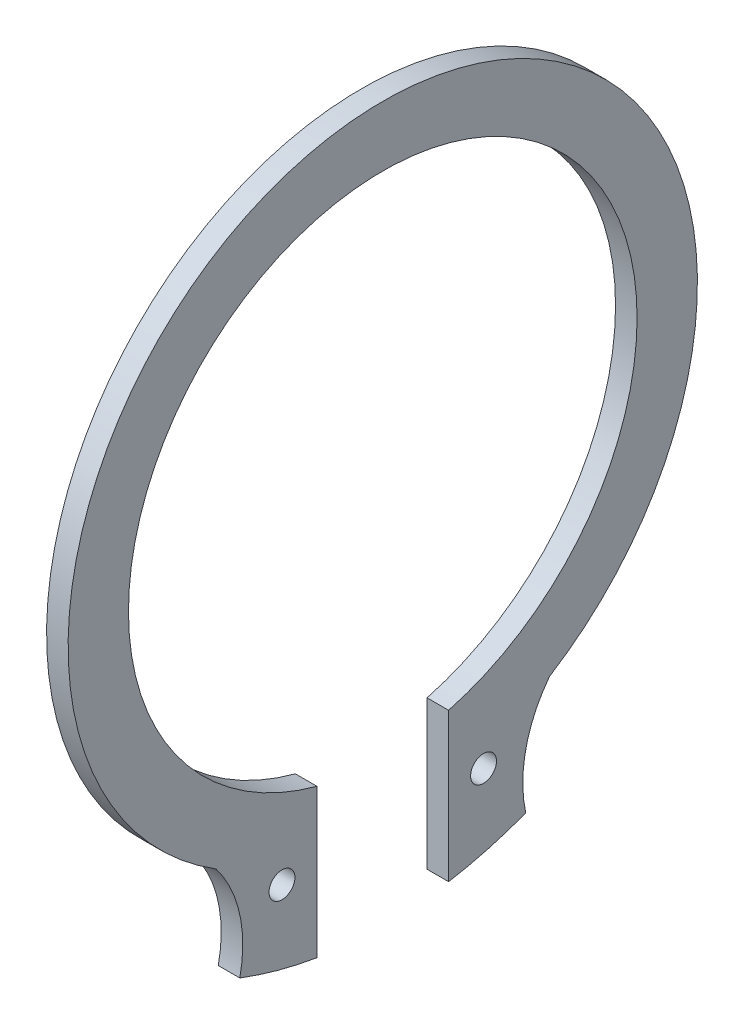
ISO-10303-21;
HEADER;
FILE_DESCRIPTION(('STEP AP214'),'2;1');
FILE_NAME('part.step','',(''),(''),'','','');
FILE_SCHEMA(('AUTOMOTIVE_DESIGN { 1 0 10303 214 1 1 1 1 }'));
ENDSEC;
DATA;
#1=APPLICATION_CONTEXT('core data for automotive mechanical design processes');
#2=APPLICATION_PROTOCOL_DEFINITION('international standard','automotive_design',2000,#1);
#3=PRODUCT_CONTEXT('',#1,'mechanical');
#4=PRODUCT('Part','Part','',(#3));
#5=PRODUCT_RELATED_PRODUCT_CATEGORY('part','',(#4));
#6=PRODUCT_DEFINITION_FORMATION('','',#4);
#7=PRODUCT_DEFINITION_CONTEXT('part definition',#1,'design');
#8=PRODUCT_DEFINITION('design','',#6,#7);
#9=PRODUCT_DEFINITION_SHAPE('','',#8);
#10=(LENGTH_UNIT() NAMED_UNIT(*) SI_UNIT(.MILLI.,.METRE.));
#11=(NAMED_UNIT(*) PLANE_ANGLE_UNIT() SI_UNIT($,.RADIAN.));
#12=(NAMED_UNIT(*) SI_UNIT($,.STERADIAN.) SOLID_ANGLE_UNIT());
#13=UNCERTAINTY_MEASURE_WITH_UNIT(LENGTH_MEASURE(1.E-05),#10,'distance_accuracy_value','');
#14=(GEOMETRIC_REPRESENTATION_CONTEXT(3) GLOBAL_UNCERTAINTY_ASSIGNED_CONTEXT((#13)) GLOBAL_UNIT_ASSIGNED_CONTEXT((#10,
#11,#12)) REPRESENTATION_CONTEXT('',''));
#15=CARTESIAN_POINT('',(0.,0.,0.));
#16=DIRECTION('',(0.,0.,1.));
#17=DIRECTION('',(1.,0.,0.));
#18=AXIS2_PLACEMENT_3D('',#15,#16,#17);
#19=CARTESIAN_POINT('',(2.5,-40.0850842394597,-31.240494090419));
#20=DIRECTION('',(-1.,0.,0.));
#21=DIRECTION('',(0.,0.,1.));
#22=AXIS2_PLACEMENT_3D('',#19,#20,#21);
#23=PLANE('',#22);
#24=CARTESIAN_POINT('',(2.5,-40.0850842394597,-31.240494090419));
#25=DIRECTION('',(-1.,0.,0.));
#26=DIRECTION('',(0.,0.,1.));
#27=AXIS2_PLACEMENT_3D('',#24,#25,#26);
#28=CIRCLE('',#27,15.);
#29=CARTESIAN_POINT('',(2.5,-43.2811948248844,-16.5849532568048));
#30=VERTEX_POINT('',#29);
#31=CARTESIAN_POINT('',(2.5,-30.9560717102877,-19.3383459547999));
#32=VERTEX_POINT('',#31);
#33=EDGE_CURVE('E147',#30,#32,#28,.T.);
#34=ORIENTED_EDGE('',*,*,#33,.T.);
#35=CARTESIAN_POINT('',(2.5,0.,0.));
#36=DIRECTION('',(1.,0.,0.));
#37=DIRECTION('',(0.,0.,-1.));
#38=AXIS2_PLACEMENT_3D('',#35,#36,#37);
#39=CIRCLE('',#38,36.5);
#40=CARTESIAN_POINT('',(2.5,-30.9560717102877,19.3383459547999));
#41=VERTEX_POINT('',#40);
#42=EDGE_CURVE('E95',#32,#41,#39,.T.);
#43=ORIENTED_EDGE('',*,*,#42,.T.);
#44=CARTESIAN_POINT('',(2.5,-40.0850842394597,31.240494090419));
#45=DIRECTION('',(-1.,0.,0.));
#46=DIRECTION('',(0.,0.,-1.));
#47=AXIS2_PLACEMENT_3D('',#44,#45,#46);
#48=CIRCLE('',#47,15.);
#49=CARTESIAN_POINT('',(2.5,-43.2811948248844,16.5849532568047));
#50=VERTEX_POINT('',#49);
#51=EDGE_CURVE('E162',#41,#50,#48,.T.);
#52=ORIENTED_EDGE('',*,*,#51,.T.);
#53=CARTESIAN_POINT('',(2.5,0.,0.));
#54=DIRECTION('',(1.,0.,0.));
#55=DIRECTION('',(0.,0.,-1.));
#56=AXIS2_PLACEMENT_3D('',#53,#54,#55);
#57=CIRCLE('',#56,46.35);
#58=CARTESIAN_POINT('',(2.5,-45.7168109541961,7.63516183052438));
#59=VERTEX_POINT('',#58);
#60=EDGE_CURVE('E175',#50,#59,#57,.T.);
#61=ORIENTED_EDGE('',*,*,#60,.T.);
#62=DIRECTION('',(0.,1.,0.));
#63=VECTOR('',#62,1.);
#64=CARTESIAN_POINT('',(2.5,-28.4948118755275,7.63516183052438));
#65=LINE('',#64,#63);
#66=CARTESIAN_POINT('',(2.5,-28.4948118755275,7.63516183052436));
#67=VERTEX_POINT('',#66);
#68=EDGE_CURVE('E114',#59,#67,#65,.T.);
#69=ORIENTED_EDGE('',*,*,#68,.T.);
#70=CARTESIAN_POINT('',(2.5,0.,0.));
#71=DIRECTION('',(-1.,0.,0.));
#72=DIRECTION('',(0.,0.,-1.));
#73=AXIS2_PLACEMENT_3D('',#70,#71,#72);
#74=CIRCLE('',#73,29.5);
#75=CARTESIAN_POINT('',(2.5,-28.4948118755275,-7.63516183052439));
#76=VERTEX_POINT('',#75);
#77=EDGE_CURVE('E108',#67,#76,#74,.T.);
#78=ORIENTED_EDGE('',*,*,#77,.T.);
#79=DIRECTION('',(0.,-1.,0.));
#80=VECTOR('',#79,1.);
#81=CARTESIAN_POINT('',(2.5,-28.4948118755275,-7.63516183052439));
#82=LINE('',#81,#80);
#83=CARTESIAN_POINT('',(2.5,-45.7168109541961,-7.63516183052439));
#84=VERTEX_POINT('',#83);
#85=EDGE_CURVE('E112',#76,#84,#82,.T.);
#86=ORIENTED_EDGE('',*,*,#85,.T.);
#87=CARTESIAN_POINT('',(2.5,0.,0.));
#88=DIRECTION('',(1.,0.,0.));
#89=DIRECTION('',(0.,0.,1.));
#90=AXIS2_PLACEMENT_3D('',#87,#88,#89);
#91=CIRCLE('',#90,46.35);
#92=EDGE_CURVE('E52',#84,#30,#91,.T.);
#93=ORIENTED_EDGE('',*,*,#92,.T.);
#94=EDGE_LOOP('',(#34,#43,#52,#61,#69,#78,#86,#93));
#95=FACE_BOUND('',#94,.T.);
#96=CARTESIAN_POINT('',(2.5,-36.3642688667526,11.6902262832212));
#97=DIRECTION('',(1.,0.,0.));
#98=DIRECTION('',(0.,0.,-1.));
#99=AXIS2_PLACEMENT_3D('',#96,#97,#98);
#100=CIRCLE('',#99,1.5);
#101=CARTESIAN_POINT('',(2.5,-36.3642688667526,10.1902262832212));
#102=VERTEX_POINT('',#101);
#103=EDGE_CURVE('E136',#102,#102,#100,.T.);
#104=ORIENTED_EDGE('',*,*,#103,.F.);
#105=EDGE_LOOP('',(#104));
#106=FACE_BOUND('',#105,.T.);
#107=CARTESIAN_POINT('',(2.5,-36.3642688667526,-11.6902262832213));
#108=DIRECTION('',(1.,0.,0.));
#109=DIRECTION('',(0.,0.,1.));
#110=AXIS2_PLACEMENT_3D('',#107,#108,#109);
#111=CIRCLE('',#110,1.5);
#112=CARTESIAN_POINT('',(2.5,-36.3642688667526,-10.1902262832213));
#113=VERTEX_POINT('',#112);
#114=EDGE_CURVE('E184',#113,#113,#111,.T.);
#115=ORIENTED_EDGE('',*,*,#114,.F.);
#116=EDGE_LOOP('',(#115));
#117=FACE_BOUND('',#116,.T.);
#118=ADVANCED_FACE('F35',(#95,#106,#117),#23,.F.);
#119=CARTESIAN_POINT('',(0.,-40.0850842394597,-31.240494090419));
#120=DIRECTION('',(-1.,0.,0.));
#121=DIRECTION('',(0.,0.,1.));
#122=AXIS2_PLACEMENT_3D('',#119,#120,#121);
#123=PLANE('',#122);
#124=CARTESIAN_POINT('',(0.,-36.3642688667526,11.6902262832212));
#125=DIRECTION('',(1.,0.,0.));
#126=DIRECTION('',(0.,0.,-1.));
#127=AXIS2_PLACEMENT_3D('',#124,#125,#126);
#128=CIRCLE('',#127,1.5);
#129=CARTESIAN_POINT('',(0.,-36.3642688667526,10.1902262832212));
#130=VERTEX_POINT('',#129);
#131=EDGE_CURVE('E181',#130,#130,#128,.T.);
#132=ORIENTED_EDGE('',*,*,#131,.T.);
#133=EDGE_LOOP('',(#132));
#134=FACE_BOUND('',#133,.T.);
#135=CARTESIAN_POINT('',(0.,-40.0850842394597,-31.240494090419));
#136=DIRECTION('',(-1.,0.,0.));
#137=DIRECTION('',(0.,0.,1.));
#138=AXIS2_PLACEMENT_3D('',#135,#136,#137);
#139=CIRCLE('',#138,15.);
#140=CARTESIAN_POINT('',(0.,-43.2811948248844,-16.5849532568048));
#141=VERTEX_POINT('',#140);
#142=CARTESIAN_POINT('',(0.,-30.9560717102877,-19.3383459547999));
#143=VERTEX_POINT('',#142);
#144=EDGE_CURVE('E132',#141,#143,#139,.T.);
#145=ORIENTED_EDGE('',*,*,#144,.F.);
#146=CARTESIAN_POINT('',(0.,0.,0.));
#147=DIRECTION('',(1.,0.,0.));
#148=DIRECTION('',(0.,0.,1.));
#149=AXIS2_PLACEMENT_3D('',#146,#147,#148);
#150=CIRCLE('',#149,46.35);
#151=CARTESIAN_POINT('',(0.,-45.7168109541961,-7.63516183052439));
#152=VERTEX_POINT('',#151);
#153=EDGE_CURVE('E87',#152,#141,#150,.T.);
#154=ORIENTED_EDGE('',*,*,#153,.F.);
#155=DIRECTION('',(0.,-1.,0.));
#156=VECTOR('',#155,1.);
#157=CARTESIAN_POINT('',(0.,-28.4948118755275,-7.63516183052439));
#158=LINE('',#157,#156);
#159=CARTESIAN_POINT('',(0.,-28.4948118755275,-7.63516183052439));
#160=VERTEX_POINT('',#159);
#161=EDGE_CURVE('E81',#160,#152,#158,.T.);
#162=ORIENTED_EDGE('',*,*,#161,.F.);
#163=CARTESIAN_POINT('',(0.,0.,0.));
#164=DIRECTION('',(-1.,0.,0.));
#165=DIRECTION('',(0.,0.,-1.));
#166=AXIS2_PLACEMENT_3D('',#163,#164,#165);
#167=CIRCLE('',#166,29.5);
#168=CARTESIAN_POINT('',(0.,-28.4948118755275,7.63516183052436));
#169=VERTEX_POINT('',#168);
#170=EDGE_CURVE('E122',#169,#160,#167,.T.);
#171=ORIENTED_EDGE('',*,*,#170,.F.);
#172=DIRECTION('',(0.,1.,0.));
#173=VECTOR('',#172,1.);
#174=CARTESIAN_POINT('',(0.,-28.4948118755275,7.63516183052438));
#175=LINE('',#174,#173);
#176=CARTESIAN_POINT('',(0.,-45.7168109541961,7.63516183052438));
#177=VERTEX_POINT('',#176);
#178=EDGE_CURVE('E142',#177,#169,#175,.T.);
#179=ORIENTED_EDGE('',*,*,#178,.F.);
#180=CARTESIAN_POINT('',(0.,0.,0.));
#181=DIRECTION('',(1.,0.,0.));
#182=DIRECTION('',(0.,0.,-1.));
#183=AXIS2_PLACEMENT_3D('',#180,#181,#182);
#184=CIRCLE('',#183,46.35);
#185=CARTESIAN_POINT('',(0.,-43.2811948248844,16.5849532568047));
#186=VERTEX_POINT('',#185);
#187=EDGE_CURVE('E140',#186,#177,#184,.T.);
#188=ORIENTED_EDGE('',*,*,#187,.F.);
#189=CARTESIAN_POINT('',(0.,-40.0850842394597,31.240494090419));
#190=DIRECTION('',(-1.,0.,0.));
#191=DIRECTION('',(0.,0.,-1.));
#192=AXIS2_PLACEMENT_3D('',#189,#190,#191);
#193=CIRCLE('',#192,15.);
#194=CARTESIAN_POINT('',(0.,-30.9560717102877,19.3383459547999));
#195=VERTEX_POINT('',#194);
#196=EDGE_CURVE('E138',#195,#186,#193,.T.);
#197=ORIENTED_EDGE('',*,*,#196,.F.);
#198=CARTESIAN_POINT('',(0.,0.,0.));
#199=DIRECTION('',(1.,0.,0.));
#200=DIRECTION('',(0.,0.,-1.));
#201=AXIS2_PLACEMENT_3D('',#198,#199,#200);
#202=CIRCLE('',#201,36.5);
#203=EDGE_CURVE('E135',#143,#195,#202,.T.);
#204=ORIENTED_EDGE('',*,*,#203,.F.);
#205=EDGE_LOOP('',(#145,#154,#162,#171,#179,#188,#197,#204));
#206=FACE_BOUND('',#205,.T.);
#207=CARTESIAN_POINT('',(0.,-36.3642688667526,-11.6902262832213));
#208=DIRECTION('',(1.,0.,0.));
#209=DIRECTION('',(0.,0.,1.));
#210=AXIS2_PLACEMENT_3D('',#207,#208,#209);
#211=CIRCLE('',#210,1.5);
#212=CARTESIAN_POINT('',(0.,-36.3642688667526,-10.1902262832213));
#213=VERTEX_POINT('',#212);
#214=EDGE_CURVE('E187',#213,#213,#211,.T.);
#215=ORIENTED_EDGE('',*,*,#214,.T.);
#216=EDGE_LOOP('',(#215));
#217=FACE_BOUND('',#216,.T.);
#218=ADVANCED_FACE('F166',(#134,#206,#217),#123,.T.);
#219=CARTESIAN_POINT('',(2.5,-40.0850842394597,-31.240494090419));
#220=DIRECTION('',(-1.,0.,0.));
#221=DIRECTION('',(0.,0.,1.));
#222=AXIS2_PLACEMENT_3D('',#219,#220,#221);
#223=CYLINDRICAL_SURFACE('',#222,15.);
#224=ORIENTED_EDGE('',*,*,#144,.T.);
#225=DIRECTION('',(-1.,0.,0.));
#226=VECTOR('',#225,1.);
#227=CARTESIAN_POINT('',(2.5,-30.9560717102877,-19.3383459547999));
#228=LINE('',#227,#226);
#229=EDGE_CURVE('E11',#32,#143,#228,.T.);
#230=ORIENTED_EDGE('',*,*,#229,.F.);
#231=ORIENTED_EDGE('',*,*,#33,.F.);
#232=DIRECTION('',(-1.,0.,0.));
#233=VECTOR('',#232,1.);
#234=CARTESIAN_POINT('',(2.5,-43.2811948248844,-16.5849532568048));
#235=LINE('',#234,#233);
#236=EDGE_CURVE('E128',#30,#141,#235,.T.);
#237=ORIENTED_EDGE('',*,*,#236,.T.);
#238=EDGE_LOOP('',(#224,#230,#231,#237));
#239=FACE_BOUND('',#238,.T.);
#240=ADVANCED_FACE('F37',(#239),#223,.F.);
#241=CARTESIAN_POINT('',(2.5,0.,0.));
#242=DIRECTION('',(-1.,0.,0.));
#243=DIRECTION('',(0.,0.,1.));
#244=AXIS2_PLACEMENT_3D('',#241,#242,#243);
#245=CYLINDRICAL_SURFACE('',#244,36.5);
#246=ORIENTED_EDGE('',*,*,#203,.T.);
#247=DIRECTION('',(-1.,0.,0.));
#248=VECTOR('',#247,1.);
#249=CARTESIAN_POINT('',(2.5,-30.9560717102877,19.3383459547999));
#250=LINE('',#249,#248);
#251=EDGE_CURVE('E44',#41,#195,#250,.T.);
#252=ORIENTED_EDGE('',*,*,#251,.F.);
#253=ORIENTED_EDGE('',*,*,#42,.F.);
#254=ORIENTED_EDGE('',*,*,#229,.T.);
#255=EDGE_LOOP('',(#246,#252,#253,#254));
#256=FACE_BOUND('',#255,.T.);
#257=ADVANCED_FACE('F219',(#256),#245,.T.);
#258=CARTESIAN_POINT('',(2.5,-40.0850842394597,31.240494090419));
#259=DIRECTION('',(-1.,0.,0.));
#260=DIRECTION('',(0.,0.,1.));
#261=AXIS2_PLACEMENT_3D('',#258,#259,#260);
#262=CYLINDRICAL_SURFACE('',#261,15.);
#263=ORIENTED_EDGE('',*,*,#196,.T.);
#264=DIRECTION('',(-1.,0.,0.));
#265=VECTOR('',#264,1.);
#266=CARTESIAN_POINT('',(2.5,-43.2811948248844,16.5849532568047));
#267=LINE('',#266,#265);
#268=EDGE_CURVE('E154',#50,#186,#267,.T.);
#269=ORIENTED_EDGE('',*,*,#268,.F.);
#270=ORIENTED_EDGE('',*,*,#51,.F.);
#271=ORIENTED_EDGE('',*,*,#251,.T.);
#272=EDGE_LOOP('',(#263,#269,#270,#271));
#273=FACE_BOUND('',#272,.T.);
#274=ADVANCED_FACE('F160',(#273),#262,.F.);
#275=CARTESIAN_POINT('',(2.5,0.,0.));
#276=DIRECTION('',(-1.,0.,0.));
#277=DIRECTION('',(0.,0.,1.));
#278=AXIS2_PLACEMENT_3D('',#275,#276,#277);
#279=CYLINDRICAL_SURFACE('',#278,46.35);
#280=ORIENTED_EDGE('',*,*,#187,.T.);
#281=DIRECTION('',(-1.,0.,0.));
#282=VECTOR('',#281,1.);
#283=CARTESIAN_POINT('',(2.5,-45.7168109541961,7.63516183052438));
#284=LINE('',#283,#282);
#285=EDGE_CURVE('E151',#59,#177,#284,.T.);
#286=ORIENTED_EDGE('',*,*,#285,.F.);
#287=ORIENTED_EDGE('',*,*,#60,.F.);
#288=ORIENTED_EDGE('',*,*,#268,.T.);
#289=EDGE_LOOP('',(#280,#286,#287,#288));
#290=FACE_BOUND('',#289,.T.);
#291=ADVANCED_FACE('F171',(#290),#279,.T.);
#292=CARTESIAN_POINT('',(2.5,-28.4948118755275,7.63516183052438));
#293=DIRECTION('',(0.,0.,1.));
#294=DIRECTION('',(0.,-1.,0.));
#295=AXIS2_PLACEMENT_3D('',#292,#293,#294);
#296=PLANE('',#295);
#297=ORIENTED_EDGE('',*,*,#178,.T.);
#298=DIRECTION('',(-1.,0.,0.));
#299=VECTOR('',#298,1.);
#300=CARTESIAN_POINT('',(2.5,-28.4948118755275,7.63516183052436));
#301=LINE('',#300,#299);
#302=EDGE_CURVE('E123',#67,#169,#301,.T.);
#303=ORIENTED_EDGE('',*,*,#302,.F.);
#304=ORIENTED_EDGE('',*,*,#68,.F.);
#305=ORIENTED_EDGE('',*,*,#285,.T.);
#306=EDGE_LOOP('',(#297,#303,#304,#305));
#307=FACE_BOUND('',#306,.T.);
#308=ADVANCED_FACE('F174',(#307),#296,.F.);
#309=CARTESIAN_POINT('',(2.5,0.,0.));
#310=DIRECTION('',(-1.,0.,0.));
#311=DIRECTION('',(0.,0.,1.));
#312=AXIS2_PLACEMENT_3D('',#309,#310,#311);
#313=CYLINDRICAL_SURFACE('',#312,29.5);
#314=ORIENTED_EDGE('',*,*,#170,.T.);
#315=DIRECTION('',(-1.,0.,0.));
#316=VECTOR('',#315,1.);
#317=CARTESIAN_POINT('',(2.5,-28.4948118755275,-7.63516183052439));
#318=LINE('',#317,#316);
#319=EDGE_CURVE('E119',#76,#160,#318,.T.);
#320=ORIENTED_EDGE('',*,*,#319,.F.);
#321=ORIENTED_EDGE('',*,*,#77,.F.);
#322=ORIENTED_EDGE('',*,*,#302,.T.);
#323=EDGE_LOOP('',(#314,#320,#321,#322));
#324=FACE_BOUND('',#323,.T.);
#325=ADVANCED_FACE('F120',(#324),#313,.F.);
#326=CARTESIAN_POINT('',(2.5,-28.4948118755275,-7.63516183052439));
#327=DIRECTION('',(0.,0.,-1.));
#328=DIRECTION('',(0.,1.,0.));
#329=AXIS2_PLACEMENT_3D('',#326,#327,#328);
#330=PLANE('',#329);
#331=ORIENTED_EDGE('',*,*,#161,.T.);
#332=DIRECTION('',(-1.,0.,0.));
#333=VECTOR('',#332,1.);
#334=CARTESIAN_POINT('',(2.5,-45.7168109541961,-7.63516183052439));
#335=LINE('',#334,#333);
#336=EDGE_CURVE('E124',#84,#152,#335,.T.);
#337=ORIENTED_EDGE('',*,*,#336,.F.);
#338=ORIENTED_EDGE('',*,*,#85,.F.);
#339=ORIENTED_EDGE('',*,*,#319,.T.);
#340=EDGE_LOOP('',(#331,#337,#338,#339));
#341=FACE_BOUND('',#340,.T.);
#342=ADVANCED_FACE('F126',(#341),#330,.F.);
#343=CARTESIAN_POINT('',(2.5,0.,0.));
#344=DIRECTION('',(-1.,0.,0.));
#345=DIRECTION('',(0.,0.,1.));
#346=AXIS2_PLACEMENT_3D('',#343,#344,#345);
#347=CYLINDRICAL_SURFACE('',#346,46.35);
#348=ORIENTED_EDGE('',*,*,#153,.T.);
#349=ORIENTED_EDGE('',*,*,#236,.F.);
#350=ORIENTED_EDGE('',*,*,#92,.F.);
#351=ORIENTED_EDGE('',*,*,#336,.T.);
#352=EDGE_LOOP('',(#348,#349,#350,#351));
#353=FACE_BOUND('',#352,.T.);
#354=ADVANCED_FACE('F207',(#353),#347,.T.);
#355=CARTESIAN_POINT('',(2.5,-36.3642688667526,11.6902262832212));
#356=DIRECTION('',(-1.,0.,0.));
#357=DIRECTION('',(0.,0.,1.));
#358=AXIS2_PLACEMENT_3D('',#355,#356,#357);
#359=CYLINDRICAL_SURFACE('',#358,1.5);
#360=ORIENTED_EDGE('',*,*,#103,.T.);
#361=EDGE_LOOP('',(#360));
#362=FACE_BOUND('',#361,.T.);
#363=ORIENTED_EDGE('',*,*,#131,.F.);
#364=EDGE_LOOP('',(#363));
#365=FACE_BOUND('',#364,.T.);
#366=ADVANCED_FACE('F204',(#362,#365),#359,.F.);
#367=CARTESIAN_POINT('',(2.5,-36.3642688667526,-11.6902262832213));
#368=DIRECTION('',(-1.,0.,0.));
#369=DIRECTION('',(0.,0.,1.));
#370=AXIS2_PLACEMENT_3D('',#367,#368,#369);
#371=CYLINDRICAL_SURFACE('',#370,1.5);
#372=ORIENTED_EDGE('',*,*,#114,.T.);
#373=EDGE_LOOP('',(#372));
#374=FACE_BOUND('',#373,.T.);
#375=ORIENTED_EDGE('',*,*,#214,.F.);
#376=EDGE_LOOP('',(#375));
#377=FACE_BOUND('',#376,.T.);
#378=ADVANCED_FACE('F193',(#374,#377),#371,.F.);
#379=CLOSED_SHELL('',(#118,#218,#240,#257,#274,#291,#308,#325,#342,#354,#366,#378));
#380=MANIFOLD_SOLID_BREP('B2',#379);
#381=ADVANCED_BREP_SHAPE_REPRESENTATION('',(#18,#380),#14);
#382=SHAPE_DEFINITION_REPRESENTATION(#9,#381);
ENDSEC;
END-ISO-10303-21;
